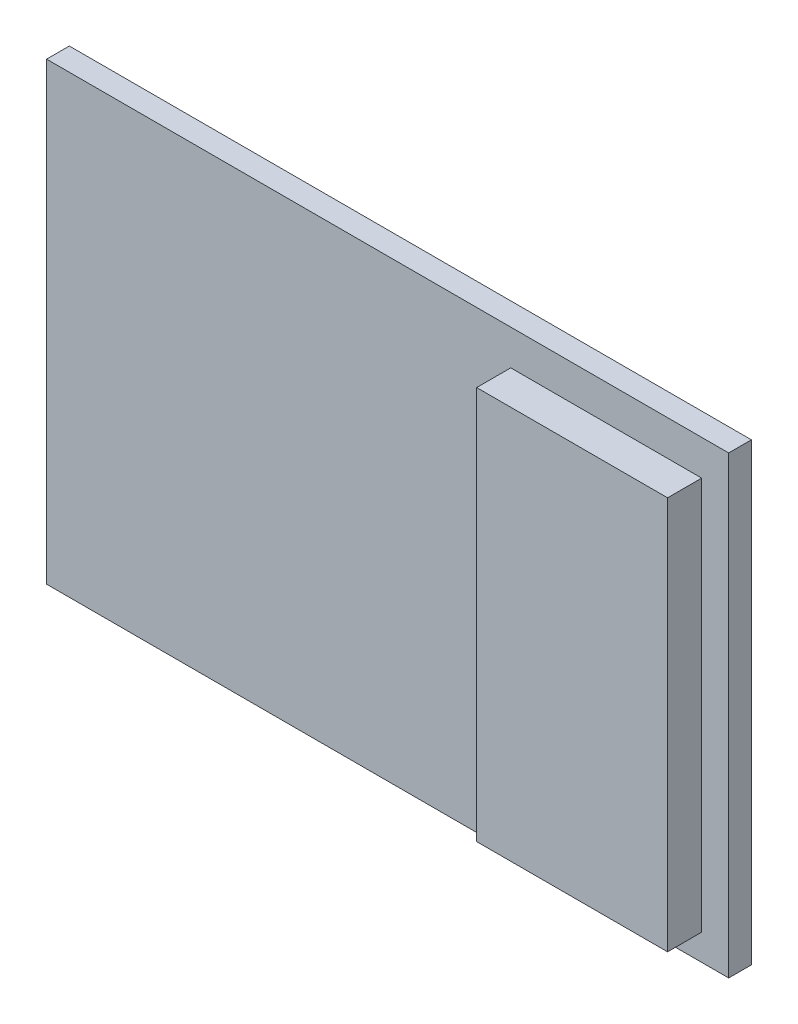
ISO-10303-21;
HEADER;
FILE_DESCRIPTION(('STEP AP214'),'2;1');
FILE_NAME('part.step','',(''),(''),'','','');
FILE_SCHEMA(('AUTOMOTIVE_DESIGN { 1 0 10303 214 1 1 1 1 }'));
ENDSEC;
DATA;
#1=APPLICATION_CONTEXT('core data for automotive mechanical design processes');
#2=APPLICATION_PROTOCOL_DEFINITION('international standard','automotive_design',2000,#1);
#3=PRODUCT_CONTEXT('',#1,'mechanical');
#4=PRODUCT('Part','Part','',(#3));
#5=PRODUCT_RELATED_PRODUCT_CATEGORY('part','',(#4));
#6=PRODUCT_DEFINITION_FORMATION('','',#4);
#7=PRODUCT_DEFINITION_CONTEXT('part definition',#1,'design');
#8=PRODUCT_DEFINITION('design','',#6,#7);
#9=PRODUCT_DEFINITION_SHAPE('','',#8);
#10=(LENGTH_UNIT() NAMED_UNIT(*) SI_UNIT(.MILLI.,.METRE.));
#11=(NAMED_UNIT(*) PLANE_ANGLE_UNIT() SI_UNIT($,.RADIAN.));
#12=(NAMED_UNIT(*) SI_UNIT($,.STERADIAN.) SOLID_ANGLE_UNIT());
#13=UNCERTAINTY_MEASURE_WITH_UNIT(LENGTH_MEASURE(1.E-05),#10,'distance_accuracy_value','');
#14=(GEOMETRIC_REPRESENTATION_CONTEXT(3) GLOBAL_UNCERTAINTY_ASSIGNED_CONTEXT((#13)) GLOBAL_UNIT_ASSIGNED_CONTEXT((#10,
#11,#12)) REPRESENTATION_CONTEXT('',''));
#15=CARTESIAN_POINT('',(0.,0.,0.));
#16=DIRECTION('',(0.,0.,1.));
#17=DIRECTION('',(1.,0.,0.));
#18=AXIS2_PLACEMENT_3D('',#15,#16,#17);
#19=CARTESIAN_POINT('',(0.,0.,2.));
#20=DIRECTION('',(0.,0.,1.));
#21=DIRECTION('',(1.,0.,0.));
#22=AXIS2_PLACEMENT_3D('',#19,#20,#21);
#23=PLANE('',#22);
#24=DIRECTION('',(0.,1.,0.));
#25=VECTOR('',#24,1.);
#26=CARTESIAN_POINT('',(30.,20.,2.));
#27=LINE('',#26,#25);
#28=CARTESIAN_POINT('',(30.,-20.,2.));
#29=VERTEX_POINT('',#28);
#30=CARTESIAN_POINT('',(30.,20.,2.));
#31=VERTEX_POINT('',#30);
#32=EDGE_CURVE('E140',#29,#31,#27,.T.);
#33=ORIENTED_EDGE('',*,*,#32,.T.);
#34=DIRECTION('',(-1.,0.,0.));
#35=VECTOR('',#34,1.);
#36=CARTESIAN_POINT('',(-30.,20.,2.));
#37=LINE('',#36,#35);
#38=CARTESIAN_POINT('',(-30.,20.,2.));
#39=VERTEX_POINT('',#38);
#40=EDGE_CURVE('E85',#31,#39,#37,.T.);
#41=ORIENTED_EDGE('',*,*,#40,.T.);
#42=DIRECTION('',(0.,-1.,0.));
#43=VECTOR('',#42,1.);
#44=CARTESIAN_POINT('',(-30.,20.,2.));
#45=LINE('',#44,#43);
#46=CARTESIAN_POINT('',(-30.,-20.,2.));
#47=VERTEX_POINT('',#46);
#48=EDGE_CURVE('E143',#39,#47,#45,.T.);
#49=ORIENTED_EDGE('',*,*,#48,.T.);
#50=DIRECTION('',(1.,0.,0.));
#51=VECTOR('',#50,1.);
#52=CARTESIAN_POINT('',(-30.,-20.,2.));
#53=LINE('',#52,#51);
#54=EDGE_CURVE('E57',#47,#29,#53,.T.);
#55=ORIENTED_EDGE('',*,*,#54,.T.);
#56=EDGE_LOOP('',(#33,#41,#49,#55));
#57=FACE_BOUND('',#56,.T.);
#58=DIRECTION('',(1.,0.,0.));
#59=VECTOR('',#58,1.);
#60=CARTESIAN_POINT('',(10.8304577115101,-17.6953016763442,2.));
#61=LINE('',#60,#59);
#62=CARTESIAN_POINT('',(10.8304577115101,-17.6953016763442,2.));
#63=VERTEX_POINT('',#62);
#64=CARTESIAN_POINT('',(27.6259982856673,-17.6953016763442,2.));
#65=VERTEX_POINT('',#64);
#66=EDGE_CURVE('E263',#63,#65,#61,.T.);
#67=ORIENTED_EDGE('',*,*,#66,.F.);
#68=DIRECTION('',(0.,-1.,0.));
#69=VECTOR('',#68,1.);
#70=CARTESIAN_POINT('',(10.8304577115101,16.8955140299558,2.));
#71=LINE('',#70,#69);
#72=CARTESIAN_POINT('',(10.8304577115101,16.8955140299558,2.));
#73=VERTEX_POINT('',#72);
#74=EDGE_CURVE('E130',#73,#63,#71,.T.);
#75=ORIENTED_EDGE('',*,*,#74,.F.);
#76=DIRECTION('',(-1.,0.,0.));
#77=VECTOR('',#76,1.);
#78=CARTESIAN_POINT('',(10.8304577115101,16.8955140299558,2.));
#79=LINE('',#78,#77);
#80=CARTESIAN_POINT('',(27.6259982856673,16.8955140299558,2.));
#81=VERTEX_POINT('',#80);
#82=EDGE_CURVE('E126',#81,#73,#79,.T.);
#83=ORIENTED_EDGE('',*,*,#82,.F.);
#84=DIRECTION('',(0.,1.,0.));
#85=VECTOR('',#84,1.);
#86=CARTESIAN_POINT('',(27.6259982856673,16.8955140299558,2.));
#87=LINE('',#86,#85);
#88=EDGE_CURVE('E260',#65,#81,#87,.T.);
#89=ORIENTED_EDGE('',*,*,#88,.F.);
#90=EDGE_LOOP('',(#67,#75,#83,#89));
#91=FACE_BOUND('',#90,.T.);
#92=ADVANCED_FACE('F33',(#57,#91),#23,.T.);
#93=CARTESIAN_POINT('',(30.,20.,2.));
#94=DIRECTION('',(-1.,0.,0.));
#95=DIRECTION('',(0.,-1.,0.));
#96=AXIS2_PLACEMENT_3D('',#93,#94,#95);
#97=PLANE('',#96);
#98=DIRECTION('',(0.,1.,0.));
#99=VECTOR('',#98,1.);
#100=CARTESIAN_POINT('',(30.,20.,0.));
#101=LINE('',#100,#99);
#102=CARTESIAN_POINT('',(30.,-20.,0.));
#103=VERTEX_POINT('',#102);
#104=CARTESIAN_POINT('',(30.,20.,0.));
#105=VERTEX_POINT('',#104);
#106=EDGE_CURVE('E132',#103,#105,#101,.T.);
#107=ORIENTED_EDGE('',*,*,#106,.T.);
#108=DIRECTION('',(0.,0.,-1.));
#109=VECTOR('',#108,1.);
#110=CARTESIAN_POINT('',(30.,20.,2.));
#111=LINE('',#110,#109);
#112=EDGE_CURVE('E11',#31,#105,#111,.T.);
#113=ORIENTED_EDGE('',*,*,#112,.F.);
#114=ORIENTED_EDGE('',*,*,#32,.F.);
#115=DIRECTION('',(0.,0.,-1.));
#116=VECTOR('',#115,1.);
#117=CARTESIAN_POINT('',(30.,-20.,2.));
#118=LINE('',#117,#116);
#119=EDGE_CURVE('E145',#29,#103,#118,.T.);
#120=ORIENTED_EDGE('',*,*,#119,.T.);
#121=EDGE_LOOP('',(#107,#113,#114,#120));
#122=FACE_BOUND('',#121,.T.);
#123=ADVANCED_FACE('F35',(#122),#97,.F.);
#124=CARTESIAN_POINT('',(-30.,20.,2.));
#125=DIRECTION('',(0.,-1.,0.));
#126=DIRECTION('',(0.,0.,-1.));
#127=AXIS2_PLACEMENT_3D('',#124,#125,#126);
#128=PLANE('',#127);
#129=DIRECTION('',(-1.,0.,0.));
#130=VECTOR('',#129,1.);
#131=CARTESIAN_POINT('',(-30.,20.,0.));
#132=LINE('',#131,#130);
#133=CARTESIAN_POINT('',(-30.,20.,0.));
#134=VERTEX_POINT('',#133);
#135=EDGE_CURVE('E135',#105,#134,#132,.T.);
#136=ORIENTED_EDGE('',*,*,#135,.T.);
#137=DIRECTION('',(0.,0.,-1.));
#138=VECTOR('',#137,1.);
#139=CARTESIAN_POINT('',(-30.,20.,2.));
#140=LINE('',#139,#138);
#141=EDGE_CURVE('E41',#39,#134,#140,.T.);
#142=ORIENTED_EDGE('',*,*,#141,.F.);
#143=ORIENTED_EDGE('',*,*,#40,.F.);
#144=ORIENTED_EDGE('',*,*,#112,.T.);
#145=EDGE_LOOP('',(#136,#142,#143,#144));
#146=FACE_BOUND('',#145,.T.);
#147=ADVANCED_FACE('F173',(#146),#128,.F.);
#148=CARTESIAN_POINT('',(-30.,20.,2.));
#149=DIRECTION('',(1.,0.,0.));
#150=DIRECTION('',(0.,1.,0.));
#151=AXIS2_PLACEMENT_3D('',#148,#149,#150);
#152=PLANE('',#151);
#153=DIRECTION('',(0.,-1.,0.));
#154=VECTOR('',#153,1.);
#155=CARTESIAN_POINT('',(-30.,20.,0.));
#156=LINE('',#155,#154);
#157=CARTESIAN_POINT('',(-30.,-20.,0.));
#158=VERTEX_POINT('',#157);
#159=EDGE_CURVE('E148',#134,#158,#156,.T.);
#160=ORIENTED_EDGE('',*,*,#159,.T.);
#161=DIRECTION('',(0.,0.,-1.));
#162=VECTOR('',#161,1.);
#163=CARTESIAN_POINT('',(-30.,-20.,2.));
#164=LINE('',#163,#162);
#165=EDGE_CURVE('E152',#47,#158,#164,.T.);
#166=ORIENTED_EDGE('',*,*,#165,.F.);
#167=ORIENTED_EDGE('',*,*,#48,.F.);
#168=ORIENTED_EDGE('',*,*,#141,.T.);
#169=EDGE_LOOP('',(#160,#166,#167,#168));
#170=FACE_BOUND('',#169,.T.);
#171=ADVANCED_FACE('F157',(#170),#152,.F.);
#172=CARTESIAN_POINT('',(-30.,-20.,2.));
#173=DIRECTION('',(0.,1.,0.));
#174=DIRECTION('',(0.,0.,1.));
#175=AXIS2_PLACEMENT_3D('',#172,#173,#174);
#176=PLANE('',#175);
#177=DIRECTION('',(1.,0.,0.));
#178=VECTOR('',#177,1.);
#179=CARTESIAN_POINT('',(-30.,-20.,0.));
#180=LINE('',#179,#178);
#181=EDGE_CURVE('E78',#158,#103,#180,.T.);
#182=ORIENTED_EDGE('',*,*,#181,.T.);
#183=ORIENTED_EDGE('',*,*,#119,.F.);
#184=ORIENTED_EDGE('',*,*,#54,.F.);
#185=ORIENTED_EDGE('',*,*,#165,.T.);
#186=EDGE_LOOP('',(#182,#183,#184,#185));
#187=FACE_BOUND('',#186,.T.);
#188=ADVANCED_FACE('F165',(#187),#176,.F.);
#189=CARTESIAN_POINT('',(0.,0.,0.));
#190=DIRECTION('',(0.,0.,1.));
#191=DIRECTION('',(1.,0.,0.));
#192=AXIS2_PLACEMENT_3D('',#189,#190,#191);
#193=PLANE('',#192);
#194=ORIENTED_EDGE('',*,*,#106,.F.);
#195=ORIENTED_EDGE('',*,*,#181,.F.);
#196=ORIENTED_EDGE('',*,*,#159,.F.);
#197=ORIENTED_EDGE('',*,*,#135,.F.);
#198=EDGE_LOOP('',(#194,#195,#196,#197));
#199=FACE_BOUND('',#198,.T.);
#200=ADVANCED_FACE('F161',(#199),#193,.F.);
#201=CARTESIAN_POINT('',(10.8304577115101,16.8955140299558,5.));
#202=DIRECTION('',(1.,0.,0.));
#203=DIRECTION('',(0.,0.,-1.));
#204=AXIS2_PLACEMENT_3D('',#201,#202,#203);
#205=PLANE('',#204);
#206=ORIENTED_EDGE('',*,*,#74,.T.);
#207=DIRECTION('',(0.,0.,-1.));
#208=VECTOR('',#207,1.);
#209=CARTESIAN_POINT('',(10.8304577115101,-17.6953016763442,5.));
#210=LINE('',#209,#208);
#211=CARTESIAN_POINT('',(10.8304577115101,-17.6953016763442,5.));
#212=VERTEX_POINT('',#211);
#213=EDGE_CURVE('E111',#212,#63,#210,.T.);
#214=ORIENTED_EDGE('',*,*,#213,.F.);
#215=DIRECTION('',(0.,-1.,0.));
#216=VECTOR('',#215,1.);
#217=CARTESIAN_POINT('',(10.8304577115101,16.8955140299558,5.));
#218=LINE('',#217,#216);
#219=CARTESIAN_POINT('',(10.8304577115101,16.8955140299558,5.));
#220=VERTEX_POINT('',#219);
#221=EDGE_CURVE('E118',#220,#212,#218,.T.);
#222=ORIENTED_EDGE('',*,*,#221,.F.);
#223=DIRECTION('',(0.,0.,-1.));
#224=VECTOR('',#223,1.);
#225=CARTESIAN_POINT('',(10.8304577115101,16.8955140299558,5.));
#226=LINE('',#225,#224);
#227=EDGE_CURVE('E258',#220,#73,#226,.T.);
#228=ORIENTED_EDGE('',*,*,#227,.T.);
#229=EDGE_LOOP('',(#206,#214,#222,#228));
#230=FACE_BOUND('',#229,.T.);
#231=ADVANCED_FACE('F128',(#230),#205,.F.);
#232=CARTESIAN_POINT('',(10.8304577115101,-17.6953016763442,5.));
#233=DIRECTION('',(0.,1.,0.));
#234=DIRECTION('',(0.,0.,1.));
#235=AXIS2_PLACEMENT_3D('',#232,#233,#234);
#236=PLANE('',#235);
#237=ORIENTED_EDGE('',*,*,#66,.T.);
#238=DIRECTION('',(0.,0.,-1.));
#239=VECTOR('',#238,1.);
#240=CARTESIAN_POINT('',(27.6259982856673,-17.6953016763442,5.));
#241=LINE('',#240,#239);
#242=CARTESIAN_POINT('',(27.6259982856673,-17.6953016763442,5.));
#243=VERTEX_POINT('',#242);
#244=EDGE_CURVE('E114',#243,#65,#241,.T.);
#245=ORIENTED_EDGE('',*,*,#244,.F.);
#246=DIRECTION('',(1.,0.,0.));
#247=VECTOR('',#246,1.);
#248=CARTESIAN_POINT('',(10.8304577115101,-17.6953016763442,5.));
#249=LINE('',#248,#247);
#250=EDGE_CURVE('E107',#212,#243,#249,.T.);
#251=ORIENTED_EDGE('',*,*,#250,.F.);
#252=ORIENTED_EDGE('',*,*,#213,.T.);
#253=EDGE_LOOP('',(#237,#245,#251,#252));
#254=FACE_BOUND('',#253,.T.);
#255=ADVANCED_FACE('F109',(#254),#236,.F.);
#256=CARTESIAN_POINT('',(27.6259982856673,16.8955140299558,5.));
#257=DIRECTION('',(-1.,0.,0.));
#258=DIRECTION('',(0.,0.,1.));
#259=AXIS2_PLACEMENT_3D('',#256,#257,#258);
#260=PLANE('',#259);
#261=ORIENTED_EDGE('',*,*,#88,.T.);
#262=DIRECTION('',(0.,0.,-1.));
#263=VECTOR('',#262,1.);
#264=CARTESIAN_POINT('',(27.6259982856673,16.8955140299558,5.));
#265=LINE('',#264,#263);
#266=CARTESIAN_POINT('',(27.6259982856673,16.8955140299558,5.));
#267=VERTEX_POINT('',#266);
#268=EDGE_CURVE('E48',#267,#81,#265,.T.);
#269=ORIENTED_EDGE('',*,*,#268,.F.);
#270=DIRECTION('',(0.,1.,0.));
#271=VECTOR('',#270,1.);
#272=CARTESIAN_POINT('',(27.6259982856673,16.8955140299558,5.));
#273=LINE('',#272,#271);
#274=EDGE_CURVE('E117',#243,#267,#273,.T.);
#275=ORIENTED_EDGE('',*,*,#274,.F.);
#276=ORIENTED_EDGE('',*,*,#244,.T.);
#277=EDGE_LOOP('',(#261,#269,#275,#276));
#278=FACE_BOUND('',#277,.T.);
#279=ADVANCED_FACE('F186',(#278),#260,.F.);
#280=CARTESIAN_POINT('',(10.8304577115101,16.8955140299558,5.));
#281=DIRECTION('',(0.,-1.,0.));
#282=DIRECTION('',(0.,0.,-1.));
#283=AXIS2_PLACEMENT_3D('',#280,#281,#282);
#284=PLANE('',#283);
#285=ORIENTED_EDGE('',*,*,#82,.T.);
#286=ORIENTED_EDGE('',*,*,#227,.F.);
#287=DIRECTION('',(-1.,0.,0.));
#288=VECTOR('',#287,1.);
#289=CARTESIAN_POINT('',(10.8304577115101,16.8955140299558,5.));
#290=LINE('',#289,#288);
#291=EDGE_CURVE('E122',#267,#220,#290,.T.);
#292=ORIENTED_EDGE('',*,*,#291,.F.);
#293=ORIENTED_EDGE('',*,*,#268,.T.);
#294=EDGE_LOOP('',(#285,#286,#292,#293));
#295=FACE_BOUND('',#294,.T.);
#296=ADVANCED_FACE('F189',(#295),#284,.F.);
#297=CARTESIAN_POINT('',(0.,0.,5.));
#298=DIRECTION('',(0.,0.,1.));
#299=DIRECTION('',(1.,0.,0.));
#300=AXIS2_PLACEMENT_3D('',#297,#298,#299);
#301=PLANE('',#300);
#302=ORIENTED_EDGE('',*,*,#221,.T.);
#303=ORIENTED_EDGE('',*,*,#250,.T.);
#304=ORIENTED_EDGE('',*,*,#274,.T.);
#305=ORIENTED_EDGE('',*,*,#291,.T.);
#306=EDGE_LOOP('',(#302,#303,#304,#305));
#307=FACE_BOUND('',#306,.T.);
#308=ADVANCED_FACE('F121',(#307),#301,.T.);
#309=CLOSED_SHELL('',(#92,#123,#147,#171,#188,#200,#231,#255,#279,#296,#308));
#310=MANIFOLD_SOLID_BREP('B2',#309);
#311=ADVANCED_BREP_SHAPE_REPRESENTATION('',(#18,#310),#14);
#312=SHAPE_DEFINITION_REPRESENTATION(#9,#311);
ENDSEC;
END-ISO-10303-21;
